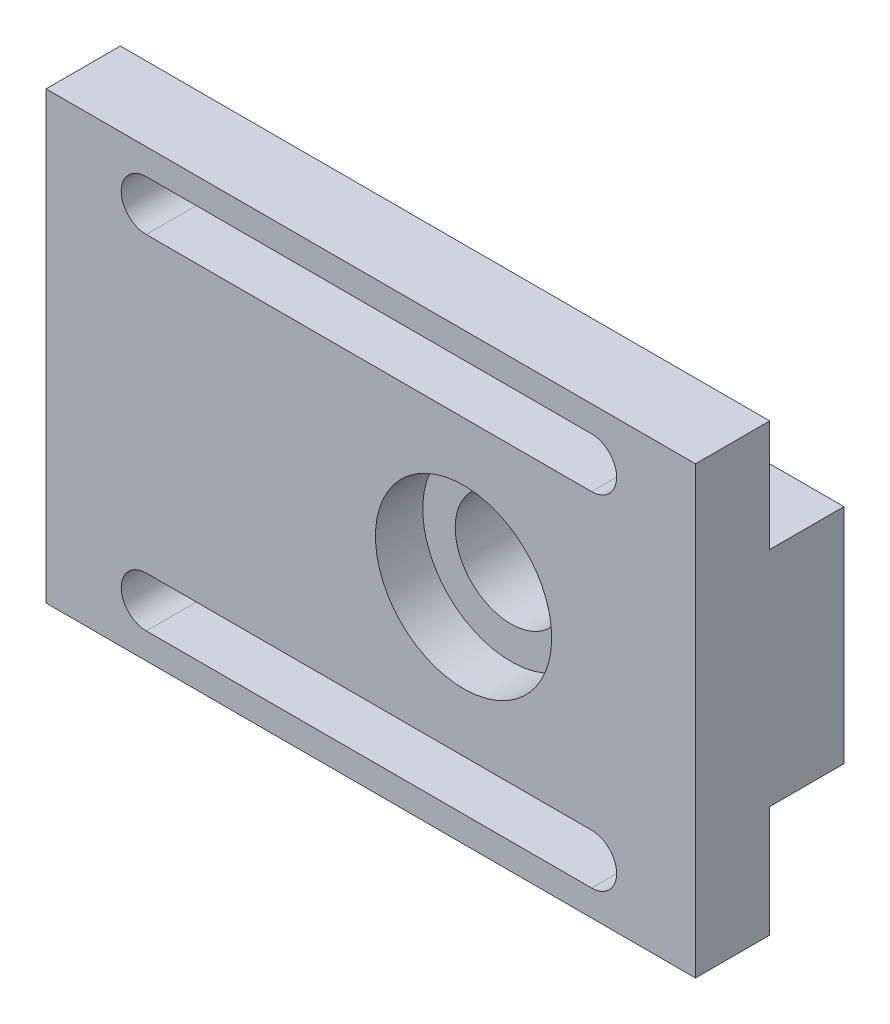
ISO-10303-21;
HEADER;
FILE_DESCRIPTION(('STEP AP214'),'2;1');
FILE_NAME('part.step','',(''),(''),'','','');
FILE_SCHEMA(('AUTOMOTIVE_DESIGN { 1 0 10303 214 1 1 1 1 }'));
ENDSEC;
DATA;
#1=APPLICATION_CONTEXT('core data for automotive mechanical design processes');
#2=APPLICATION_PROTOCOL_DEFINITION('international standard','automotive_design',2000,#1);
#3=PRODUCT_CONTEXT('',#1,'mechanical');
#4=PRODUCT('Part','Part','',(#3));
#5=PRODUCT_RELATED_PRODUCT_CATEGORY('part','',(#4));
#6=PRODUCT_DEFINITION_FORMATION('','',#4);
#7=PRODUCT_DEFINITION_CONTEXT('part definition',#1,'design');
#8=PRODUCT_DEFINITION('design','',#6,#7);
#9=PRODUCT_DEFINITION_SHAPE('','',#8);
#10=(LENGTH_UNIT() NAMED_UNIT(*) SI_UNIT(.MILLI.,.METRE.));
#11=(NAMED_UNIT(*) PLANE_ANGLE_UNIT() SI_UNIT($,.RADIAN.));
#12=(NAMED_UNIT(*) SI_UNIT($,.STERADIAN.) SOLID_ANGLE_UNIT());
#13=UNCERTAINTY_MEASURE_WITH_UNIT(LENGTH_MEASURE(1.E-05),#10,'distance_accuracy_value','');
#14=(GEOMETRIC_REPRESENTATION_CONTEXT(3) GLOBAL_UNCERTAINTY_ASSIGNED_CONTEXT((#13)) GLOBAL_UNIT_ASSIGNED_CONTEXT((#10,
#11,#12)) REPRESENTATION_CONTEXT('',''));
#15=CARTESIAN_POINT('',(0.,0.,0.));
#16=DIRECTION('',(0.,0.,1.));
#17=DIRECTION('',(1.,0.,0.));
#18=AXIS2_PLACEMENT_3D('',#15,#16,#17);
#19=CARTESIAN_POINT('',(45.,24.,8.));
#20=DIRECTION('',(0.,0.,-1.));
#21=DIRECTION('',(-1.,0.,0.));
#22=AXIS2_PLACEMENT_3D('',#19,#20,#21);
#23=CYLINDRICAL_SURFACE('',#22,6.00000000000001);
#24=CARTESIAN_POINT('',(45.,24.,-3.));
#25=DIRECTION('',(0.,0.,-1.));
#26=DIRECTION('',(-1.,0.,0.));
#27=AXIS2_PLACEMENT_3D('',#24,#25,#26);
#28=CIRCLE('',#27,6.00000000000001);
#29=CARTESIAN_POINT('',(39.,24.,-3.));
#30=VERTEX_POINT('',#29);
#31=EDGE_CURVE('E236',#30,#30,#28,.F.);
#32=ORIENTED_EDGE('',*,*,#31,.F.);
#33=EDGE_LOOP('',(#32));
#34=FACE_BOUND('',#33,.T.);
#35=CARTESIAN_POINT('',(45.,24.,2.9));
#36=DIRECTION('',(0.,0.,1.));
#37=DIRECTION('',(1.,0.,0.));
#38=AXIS2_PLACEMENT_3D('',#35,#36,#37);
#39=CIRCLE('',#38,6.00000000000001);
#40=CARTESIAN_POINT('',(51.,24.,2.9));
#41=VERTEX_POINT('',#40);
#42=EDGE_CURVE('E230',#41,#41,#39,.F.);
#43=ORIENTED_EDGE('',*,*,#42,.F.);
#44=EDGE_LOOP('',(#43));
#45=FACE_BOUND('',#44,.T.);
#46=ADVANCED_FACE('F39',(#34,#45),#23,.F.);
#47=CARTESIAN_POINT('',(0.,48.,0.));
#48=DIRECTION('',(0.,0.,-1.));
#49=DIRECTION('',(-1.,0.,0.));
#50=AXIS2_PLACEMENT_3D('',#47,#48,#49);
#51=PLANE('',#50);
#52=CARTESIAN_POINT('',(10.8004560122874,42.5,0.));
#53=DIRECTION('',(0.,0.,-1.));
#54=DIRECTION('',(-1.,0.,0.));
#55=AXIS2_PLACEMENT_3D('',#52,#53,#54);
#56=CIRCLE('',#55,2.7);
#57=CARTESIAN_POINT('',(10.8004560122874,39.8,0.));
#58=VERTEX_POINT('',#57);
#59=CARTESIAN_POINT('',(10.8004560122874,45.2,0.));
#60=VERTEX_POINT('',#59);
#61=EDGE_CURVE('E212',#58,#60,#56,.T.);
#62=ORIENTED_EDGE('',*,*,#61,.F.);
#63=DIRECTION('',(-1.,0.,0.));
#64=VECTOR('',#63,1.);
#65=CARTESIAN_POINT('',(0.,39.8,0.));
#66=LINE('',#65,#64);
#67=CARTESIAN_POINT('',(58.8004560122874,39.8,0.));
#68=VERTEX_POINT('',#67);
#69=EDGE_CURVE('E199',#68,#58,#66,.T.);
#70=ORIENTED_EDGE('',*,*,#69,.F.);
#71=CARTESIAN_POINT('',(58.8004560122874,42.5,0.));
#72=DIRECTION('',(0.,0.,-1.));
#73=DIRECTION('',(-1.,0.,0.));
#74=AXIS2_PLACEMENT_3D('',#71,#72,#73);
#75=CIRCLE('',#74,2.7);
#76=CARTESIAN_POINT('',(58.8004560122874,45.2,0.));
#77=VERTEX_POINT('',#76);
#78=EDGE_CURVE('E207',#77,#68,#75,.T.);
#79=ORIENTED_EDGE('',*,*,#78,.F.);
#80=DIRECTION('',(1.,0.,0.));
#81=VECTOR('',#80,1.);
#82=CARTESIAN_POINT('',(0.,45.2,0.));
#83=LINE('',#82,#81);
#84=EDGE_CURVE('E210',#60,#77,#83,.T.);
#85=ORIENTED_EDGE('',*,*,#84,.F.);
#86=EDGE_LOOP('',(#62,#70,#79,#85));
#87=FACE_BOUND('',#86,.T.);
#88=DIRECTION('',(1.,0.,0.));
#89=VECTOR('',#88,1.);
#90=CARTESIAN_POINT('',(70.,36.,0.));
#91=LINE('',#90,#89);
#92=CARTESIAN_POINT('',(0.,36.,0.));
#93=VERTEX_POINT('',#92);
#94=CARTESIAN_POINT('',(70.,36.,0.));
#95=VERTEX_POINT('',#94);
#96=EDGE_CURVE('E244',#93,#95,#91,.T.);
#97=ORIENTED_EDGE('',*,*,#96,.F.);
#98=DIRECTION('',(0.,-1.,0.));
#99=VECTOR('',#98,1.);
#100=CARTESIAN_POINT('',(0.,0.,0.));
#101=LINE('',#100,#99);
#102=CARTESIAN_POINT('',(0.,48.,0.));
#103=VERTEX_POINT('',#102);
#104=EDGE_CURVE('E368',#103,#93,#101,.T.);
#105=ORIENTED_EDGE('',*,*,#104,.F.);
#106=DIRECTION('',(-1.,0.,0.));
#107=VECTOR('',#106,1.);
#108=CARTESIAN_POINT('',(0.,48.,0.));
#109=LINE('',#108,#107);
#110=CARTESIAN_POINT('',(70.,48.,0.));
#111=VERTEX_POINT('',#110);
#112=EDGE_CURVE('E377',#111,#103,#109,.T.);
#113=ORIENTED_EDGE('',*,*,#112,.F.);
#114=DIRECTION('',(0.,1.,0.));
#115=VECTOR('',#114,1.);
#116=CARTESIAN_POINT('',(70.,0.,0.));
#117=LINE('',#116,#115);
#118=EDGE_CURVE('E260',#95,#111,#117,.T.);
#119=ORIENTED_EDGE('',*,*,#118,.F.);
#120=EDGE_LOOP('',(#97,#105,#113,#119));
#121=FACE_BOUND('',#120,.T.);
#122=ADVANCED_FACE('F315',(#87,#121),#51,.T.);
#123=CARTESIAN_POINT('',(0.,0.,8.));
#124=DIRECTION('',(1.,0.,0.));
#125=DIRECTION('',(0.,0.,-1.));
#126=AXIS2_PLACEMENT_3D('',#123,#124,#125);
#127=PLANE('',#126);
#128=ORIENTED_EDGE('',*,*,#104,.T.);
#129=DIRECTION('',(0.,0.,1.));
#130=VECTOR('',#129,1.);
#131=CARTESIAN_POINT('',(0.,36.,-8.));
#132=LINE('',#131,#130);
#133=CARTESIAN_POINT('',(0.,36.,-8.));
#134=VERTEX_POINT('',#133);
#135=EDGE_CURVE('E267',#134,#93,#132,.T.);
#136=ORIENTED_EDGE('',*,*,#135,.F.);
#137=DIRECTION('',(0.,1.,0.));
#138=VECTOR('',#137,1.);
#139=CARTESIAN_POINT('',(0.,12.,-8.));
#140=LINE('',#139,#138);
#141=CARTESIAN_POINT('',(0.,12.,-8.));
#142=VERTEX_POINT('',#141);
#143=EDGE_CURVE('E246',#142,#134,#140,.T.);
#144=ORIENTED_EDGE('',*,*,#143,.F.);
#145=DIRECTION('',(0.,0.,1.));
#146=VECTOR('',#145,1.);
#147=CARTESIAN_POINT('',(0.,12.,-8.));
#148=LINE('',#147,#146);
#149=CARTESIAN_POINT('',(0.,12.,0.));
#150=VERTEX_POINT('',#149);
#151=EDGE_CURVE('E263',#142,#150,#148,.T.);
#152=ORIENTED_EDGE('',*,*,#151,.T.);
#153=CARTESIAN_POINT('',(0.,0.,0.));
#154=VERTEX_POINT('',#153);
#155=EDGE_CURVE('E272',#150,#154,#101,.T.);
#156=ORIENTED_EDGE('',*,*,#155,.T.);
#157=DIRECTION('',(0.,0.,-1.));
#158=VECTOR('',#157,1.);
#159=CARTESIAN_POINT('',(0.,0.,8.));
#160=LINE('',#159,#158);
#161=CARTESIAN_POINT('',(0.,0.,8.));
#162=VERTEX_POINT('',#161);
#163=EDGE_CURVE('E291',#162,#154,#160,.T.);
#164=ORIENTED_EDGE('',*,*,#163,.F.);
#165=DIRECTION('',(0.,-1.,0.));
#166=VECTOR('',#165,1.);
#167=CARTESIAN_POINT('',(0.,0.,8.));
#168=LINE('',#167,#166);
#169=CARTESIAN_POINT('',(0.,48.,8.));
#170=VERTEX_POINT('',#169);
#171=EDGE_CURVE('E378',#170,#162,#168,.T.);
#172=ORIENTED_EDGE('',*,*,#171,.F.);
#173=DIRECTION('',(0.,0.,-1.));
#174=VECTOR('',#173,1.);
#175=CARTESIAN_POINT('',(0.,48.,8.));
#176=LINE('',#175,#174);
#177=EDGE_CURVE('E386',#170,#103,#176,.T.);
#178=ORIENTED_EDGE('',*,*,#177,.T.);
#179=EDGE_LOOP('',(#128,#136,#144,#152,#156,#164,#172,#178));
#180=FACE_BOUND('',#179,.T.);
#181=ADVANCED_FACE('F41',(#180),#127,.F.);
#182=CARTESIAN_POINT('',(0.,0.,8.));
#183=DIRECTION('',(0.,1.,0.));
#184=DIRECTION('',(0.,0.,1.));
#185=AXIS2_PLACEMENT_3D('',#182,#183,#184);
#186=PLANE('',#185);
#187=DIRECTION('',(1.,0.,0.));
#188=VECTOR('',#187,1.);
#189=CARTESIAN_POINT('',(0.,0.,0.));
#190=LINE('',#189,#188);
#191=CARTESIAN_POINT('',(70.,0.,0.));
#192=VERTEX_POINT('',#191);
#193=EDGE_CURVE('E362',#154,#192,#190,.T.);
#194=ORIENTED_EDGE('',*,*,#193,.T.);
#195=DIRECTION('',(0.,0.,-1.));
#196=VECTOR('',#195,1.);
#197=CARTESIAN_POINT('',(70.,0.,8.));
#198=LINE('',#197,#196);
#199=CARTESIAN_POINT('',(70.,0.,8.));
#200=VERTEX_POINT('',#199);
#201=EDGE_CURVE('E364',#200,#192,#198,.T.);
#202=ORIENTED_EDGE('',*,*,#201,.F.);
#203=DIRECTION('',(1.,0.,0.));
#204=VECTOR('',#203,1.);
#205=CARTESIAN_POINT('',(0.,0.,8.));
#206=LINE('',#205,#204);
#207=EDGE_CURVE('E398',#162,#200,#206,.T.);
#208=ORIENTED_EDGE('',*,*,#207,.F.);
#209=ORIENTED_EDGE('',*,*,#163,.T.);
#210=EDGE_LOOP('',(#194,#202,#208,#209));
#211=FACE_BOUND('',#210,.T.);
#212=ADVANCED_FACE('F351',(#211),#186,.F.);
#213=CARTESIAN_POINT('',(70.,0.,8.));
#214=DIRECTION('',(-1.,0.,0.));
#215=DIRECTION('',(0.,0.,1.));
#216=AXIS2_PLACEMENT_3D('',#213,#214,#215);
#217=PLANE('',#216);
#218=CARTESIAN_POINT('',(70.,12.,0.));
#219=VERTEX_POINT('',#218);
#220=EDGE_CURVE('E372',#192,#219,#117,.T.);
#221=ORIENTED_EDGE('',*,*,#220,.T.);
#222=DIRECTION('',(0.,0.,1.));
#223=VECTOR('',#222,1.);
#224=CARTESIAN_POINT('',(70.,12.,-8.));
#225=LINE('',#224,#223);
#226=CARTESIAN_POINT('',(70.,12.,-8.));
#227=VERTEX_POINT('',#226);
#228=EDGE_CURVE('E266',#227,#219,#225,.T.);
#229=ORIENTED_EDGE('',*,*,#228,.F.);
#230=DIRECTION('',(0.,-1.,0.));
#231=VECTOR('',#230,1.);
#232=CARTESIAN_POINT('',(70.,12.,-8.));
#233=LINE('',#232,#231);
#234=CARTESIAN_POINT('',(70.,36.,-8.));
#235=VERTEX_POINT('',#234);
#236=EDGE_CURVE('E240',#235,#227,#233,.T.);
#237=ORIENTED_EDGE('',*,*,#236,.F.);
#238=DIRECTION('',(0.,0.,1.));
#239=VECTOR('',#238,1.);
#240=CARTESIAN_POINT('',(70.,36.,-8.));
#241=LINE('',#240,#239);
#242=EDGE_CURVE('E250',#235,#95,#241,.T.);
#243=ORIENTED_EDGE('',*,*,#242,.T.);
#244=ORIENTED_EDGE('',*,*,#118,.T.);
#245=DIRECTION('',(0.,0.,-1.));
#246=VECTOR('',#245,1.);
#247=CARTESIAN_POINT('',(70.,48.,8.));
#248=LINE('',#247,#246);
#249=CARTESIAN_POINT('',(70.,48.,8.));
#250=VERTEX_POINT('',#249);
#251=EDGE_CURVE('E375',#250,#111,#248,.T.);
#252=ORIENTED_EDGE('',*,*,#251,.F.);
#253=DIRECTION('',(0.,1.,0.));
#254=VECTOR('',#253,1.);
#255=CARTESIAN_POINT('',(70.,0.,8.));
#256=LINE('',#255,#254);
#257=EDGE_CURVE('E374',#200,#250,#256,.T.);
#258=ORIENTED_EDGE('',*,*,#257,.F.);
#259=ORIENTED_EDGE('',*,*,#201,.T.);
#260=EDGE_LOOP('',(#221,#229,#237,#243,#244,#252,#258,#259));
#261=FACE_BOUND('',#260,.T.);
#262=ADVANCED_FACE('F348',(#261),#217,.F.);
#263=CARTESIAN_POINT('',(0.,48.,8.));
#264=DIRECTION('',(0.,-1.,0.));
#265=DIRECTION('',(0.,0.,-1.));
#266=AXIS2_PLACEMENT_3D('',#263,#264,#265);
#267=PLANE('',#266);
#268=ORIENTED_EDGE('',*,*,#112,.T.);
#269=ORIENTED_EDGE('',*,*,#177,.F.);
#270=DIRECTION('',(-1.,0.,0.));
#271=VECTOR('',#270,1.);
#272=CARTESIAN_POINT('',(0.,48.,8.));
#273=LINE('',#272,#271);
#274=EDGE_CURVE('E389',#250,#170,#273,.T.);
#275=ORIENTED_EDGE('',*,*,#274,.F.);
#276=ORIENTED_EDGE('',*,*,#251,.T.);
#277=EDGE_LOOP('',(#268,#269,#275,#276));
#278=FACE_BOUND('',#277,.T.);
#279=ADVANCED_FACE('F343',(#278),#267,.F.);
#280=CARTESIAN_POINT('',(0.,48.,8.));
#281=DIRECTION('',(0.,0.,-1.));
#282=DIRECTION('',(-1.,0.,0.));
#283=AXIS2_PLACEMENT_3D('',#280,#281,#282);
#284=PLANE('',#283);
#285=DIRECTION('',(1.,0.,0.));
#286=VECTOR('',#285,1.);
#287=CARTESIAN_POINT('',(10.8004560122874,2.8,8.));
#288=LINE('',#287,#286);
#289=CARTESIAN_POINT('',(10.8004560122874,2.8,8.));
#290=VERTEX_POINT('',#289);
#291=CARTESIAN_POINT('',(58.8004560122874,2.8,8.));
#292=VERTEX_POINT('',#291);
#293=EDGE_CURVE('E169',#290,#292,#288,.T.);
#294=ORIENTED_EDGE('',*,*,#293,.F.);
#295=CARTESIAN_POINT('',(10.8004560122874,5.5,8.));
#296=DIRECTION('',(0.,0.,1.));
#297=DIRECTION('',(-1.,0.,0.));
#298=AXIS2_PLACEMENT_3D('',#295,#296,#297);
#299=CIRCLE('',#298,2.7);
#300=CARTESIAN_POINT('',(10.8004560122874,8.2,8.));
#301=VERTEX_POINT('',#300);
#302=EDGE_CURVE('E54',#301,#290,#299,.T.);
#303=ORIENTED_EDGE('',*,*,#302,.F.);
#304=DIRECTION('',(-1.,0.,0.));
#305=VECTOR('',#304,1.);
#306=CARTESIAN_POINT('',(10.8004560122874,8.2,8.));
#307=LINE('',#306,#305);
#308=CARTESIAN_POINT('',(58.8004560122874,8.2,8.));
#309=VERTEX_POINT('',#308);
#310=EDGE_CURVE('E176',#309,#301,#307,.T.);
#311=ORIENTED_EDGE('',*,*,#310,.F.);
#312=CARTESIAN_POINT('',(58.8004560122874,5.5,8.));
#313=DIRECTION('',(0.,0.,1.));
#314=DIRECTION('',(-1.,0.,0.));
#315=AXIS2_PLACEMENT_3D('',#312,#313,#314);
#316=CIRCLE('',#315,2.7);
#317=EDGE_CURVE('E160',#292,#309,#316,.T.);
#318=ORIENTED_EDGE('',*,*,#317,.F.);
#319=EDGE_LOOP('',(#294,#303,#311,#318));
#320=FACE_BOUND('',#319,.T.);
#321=DIRECTION('',(1.,0.,0.));
#322=VECTOR('',#321,1.);
#323=CARTESIAN_POINT('',(10.8004560122874,39.8,8.));
#324=LINE('',#323,#322);
#325=CARTESIAN_POINT('',(10.8004560122874,39.8,8.));
#326=VERTEX_POINT('',#325);
#327=CARTESIAN_POINT('',(58.8004560122874,39.8,8.));
#328=VERTEX_POINT('',#327);
#329=EDGE_CURVE('E187',#326,#328,#324,.T.);
#330=ORIENTED_EDGE('',*,*,#329,.F.);
#331=CARTESIAN_POINT('',(10.8004560122874,42.5,8.));
#332=DIRECTION('',(0.,0.,1.));
#333=DIRECTION('',(1.,0.,0.));
#334=AXIS2_PLACEMENT_3D('',#331,#332,#333);
#335=CIRCLE('',#334,2.7);
#336=CARTESIAN_POINT('',(10.8004560122874,45.2,8.));
#337=VERTEX_POINT('',#336);
#338=EDGE_CURVE('E183',#337,#326,#335,.T.);
#339=ORIENTED_EDGE('',*,*,#338,.F.);
#340=DIRECTION('',(-1.,0.,0.));
#341=VECTOR('',#340,1.);
#342=CARTESIAN_POINT('',(10.8004560122874,45.2,8.));
#343=LINE('',#342,#341);
#344=CARTESIAN_POINT('',(58.8004560122874,45.2,8.));
#345=VERTEX_POINT('',#344);
#346=EDGE_CURVE('E193',#345,#337,#343,.T.);
#347=ORIENTED_EDGE('',*,*,#346,.F.);
#348=CARTESIAN_POINT('',(58.8004560122874,42.5,8.));
#349=DIRECTION('',(0.,0.,1.));
#350=DIRECTION('',(1.,0.,0.));
#351=AXIS2_PLACEMENT_3D('',#348,#349,#350);
#352=CIRCLE('',#351,2.7);
#353=EDGE_CURVE('E190',#328,#345,#352,.T.);
#354=ORIENTED_EDGE('',*,*,#353,.F.);
#355=EDGE_LOOP('',(#330,#339,#347,#354));
#356=FACE_BOUND('',#355,.T.);
#357=CARTESIAN_POINT('',(45.,24.,8.));
#358=DIRECTION('',(0.,0.,1.));
#359=DIRECTION('',(1.,0.,0.));
#360=AXIS2_PLACEMENT_3D('',#357,#358,#359);
#361=CIRCLE('',#360,9.5);
#362=CARTESIAN_POINT('',(54.5,24.,8.));
#363=VERTEX_POINT('',#362);
#364=EDGE_CURVE('E226',#363,#363,#361,.T.);
#365=ORIENTED_EDGE('',*,*,#364,.F.);
#366=EDGE_LOOP('',(#365));
#367=FACE_BOUND('',#366,.T.);
#368=ORIENTED_EDGE('',*,*,#171,.T.);
#369=ORIENTED_EDGE('',*,*,#207,.T.);
#370=ORIENTED_EDGE('',*,*,#257,.T.);
#371=ORIENTED_EDGE('',*,*,#274,.T.);
#372=EDGE_LOOP('',(#368,#369,#370,#371));
#373=FACE_BOUND('',#372,.T.);
#374=ADVANCED_FACE('F173',(#320,#356,#367,#373),#284,.F.);
#375=CARTESIAN_POINT('',(10.8004560122874,5.5,0.));
#376=DIRECTION('',(0.,0.,-1.));
#377=DIRECTION('',(-1.,0.,0.));
#378=AXIS2_PLACEMENT_3D('',#375,#376,#377);
#379=CIRCLE('',#378,2.7);
#380=CARTESIAN_POINT('',(10.8004560122874,2.8,0.));
#381=VERTEX_POINT('',#380);
#382=CARTESIAN_POINT('',(10.8004560122874,8.2,0.));
#383=VERTEX_POINT('',#382);
#384=EDGE_CURVE('E11',#381,#383,#379,.T.);
#385=ORIENTED_EDGE('',*,*,#384,.F.);
#386=DIRECTION('',(-1.,0.,0.));
#387=VECTOR('',#386,1.);
#388=CARTESIAN_POINT('',(0.,2.8,0.));
#389=LINE('',#388,#387);
#390=CARTESIAN_POINT('',(58.8004560122874,2.8,0.));
#391=VERTEX_POINT('',#390);
#392=EDGE_CURVE('E289',#391,#381,#389,.T.);
#393=ORIENTED_EDGE('',*,*,#392,.F.);
#394=CARTESIAN_POINT('',(58.8004560122874,5.5,0.));
#395=DIRECTION('',(0.,0.,-1.));
#396=DIRECTION('',(-1.,0.,0.));
#397=AXIS2_PLACEMENT_3D('',#394,#395,#396);
#398=CIRCLE('',#397,2.7);
#399=CARTESIAN_POINT('',(58.8004560122874,8.2,0.));
#400=VERTEX_POINT('',#399);
#401=EDGE_CURVE('E163',#400,#391,#398,.T.);
#402=ORIENTED_EDGE('',*,*,#401,.F.);
#403=DIRECTION('',(1.,0.,0.));
#404=VECTOR('',#403,1.);
#405=CARTESIAN_POINT('',(0.,8.2,0.));
#406=LINE('',#405,#404);
#407=EDGE_CURVE('E47',#383,#400,#406,.T.);
#408=ORIENTED_EDGE('',*,*,#407,.F.);
#409=EDGE_LOOP('',(#385,#393,#402,#408));
#410=FACE_BOUND('',#409,.T.);
#411=DIRECTION('',(-1.,0.,0.));
#412=VECTOR('',#411,1.);
#413=CARTESIAN_POINT('',(70.,12.,0.));
#414=LINE('',#413,#412);
#415=EDGE_CURVE('E256',#219,#150,#414,.T.);
#416=ORIENTED_EDGE('',*,*,#415,.F.);
#417=ORIENTED_EDGE('',*,*,#220,.F.);
#418=ORIENTED_EDGE('',*,*,#193,.F.);
#419=ORIENTED_EDGE('',*,*,#155,.F.);
#420=EDGE_LOOP('',(#416,#417,#418,#419));
#421=FACE_BOUND('',#420,.T.);
#422=ADVANCED_FACE('F298',(#410,#421),#51,.T.);
#423=CARTESIAN_POINT('',(70.,12.,-8.));
#424=DIRECTION('',(0.,1.,0.));
#425=DIRECTION('',(0.,0.,1.));
#426=AXIS2_PLACEMENT_3D('',#423,#424,#425);
#427=PLANE('',#426);
#428=ORIENTED_EDGE('',*,*,#415,.T.);
#429=ORIENTED_EDGE('',*,*,#151,.F.);
#430=DIRECTION('',(-1.,0.,0.));
#431=VECTOR('',#430,1.);
#432=CARTESIAN_POINT('',(70.,12.,-8.));
#433=LINE('',#432,#431);
#434=EDGE_CURVE('E243',#227,#142,#433,.T.);
#435=ORIENTED_EDGE('',*,*,#434,.F.);
#436=ORIENTED_EDGE('',*,*,#228,.T.);
#437=EDGE_LOOP('',(#428,#429,#435,#436));
#438=FACE_BOUND('',#437,.T.);
#439=ADVANCED_FACE('F337',(#438),#427,.F.);
#440=CARTESIAN_POINT('',(70.,36.,-8.));
#441=DIRECTION('',(0.,-1.,0.));
#442=DIRECTION('',(1.,0.,0.));
#443=AXIS2_PLACEMENT_3D('',#440,#441,#442);
#444=PLANE('',#443);
#445=ORIENTED_EDGE('',*,*,#96,.T.);
#446=ORIENTED_EDGE('',*,*,#242,.F.);
#447=DIRECTION('',(1.,0.,0.));
#448=VECTOR('',#447,1.);
#449=CARTESIAN_POINT('',(70.,36.,-8.));
#450=LINE('',#449,#448);
#451=EDGE_CURVE('E248',#134,#235,#450,.T.);
#452=ORIENTED_EDGE('',*,*,#451,.F.);
#453=ORIENTED_EDGE('',*,*,#135,.T.);
#454=EDGE_LOOP('',(#445,#446,#452,#453));
#455=FACE_BOUND('',#454,.T.);
#456=ADVANCED_FACE('F333',(#455),#444,.F.);
#457=CARTESIAN_POINT('',(70.,36.,-8.));
#458=DIRECTION('',(0.,0.,1.));
#459=DIRECTION('',(1.,0.,0.));
#460=AXIS2_PLACEMENT_3D('',#457,#458,#459);
#461=PLANE('',#460);
#462=CARTESIAN_POINT('',(57.5,24.,-8.));
#463=DIRECTION('',(0.,0.,-1.));
#464=DIRECTION('',(-1.,0.,0.));
#465=AXIS2_PLACEMENT_3D('',#462,#463,#464);
#466=CIRCLE('',#465,1.65);
#467=CARTESIAN_POINT('',(55.85,24.,-8.));
#468=VERTEX_POINT('',#467);
#469=EDGE_CURVE('E214',#468,#468,#466,.T.);
#470=ORIENTED_EDGE('',*,*,#469,.F.);
#471=EDGE_LOOP('',(#470));
#472=FACE_BOUND('',#471,.T.);
#473=CARTESIAN_POINT('',(32.5,24.,-8.));
#474=DIRECTION('',(0.,0.,-1.));
#475=DIRECTION('',(-1.,0.,0.));
#476=AXIS2_PLACEMENT_3D('',#473,#474,#475);
#477=CIRCLE('',#476,1.65);
#478=CARTESIAN_POINT('',(30.85,24.,-8.));
#479=VERTEX_POINT('',#478);
#480=EDGE_CURVE('E220',#479,#479,#477,.T.);
#481=ORIENTED_EDGE('',*,*,#480,.F.);
#482=EDGE_LOOP('',(#481));
#483=FACE_BOUND('',#482,.T.);
#484=CARTESIAN_POINT('',(45.,24.,-8.));
#485=DIRECTION('',(0.,0.,-1.));
#486=DIRECTION('',(-1.,0.,0.));
#487=AXIS2_PLACEMENT_3D('',#484,#485,#486);
#488=CIRCLE('',#487,9.5);
#489=CARTESIAN_POINT('',(35.5,24.,-8.));
#490=VERTEX_POINT('',#489);
#491=EDGE_CURVE('E237',#490,#490,#488,.T.);
#492=ORIENTED_EDGE('',*,*,#491,.F.);
#493=EDGE_LOOP('',(#492));
#494=FACE_BOUND('',#493,.T.);
#495=ORIENTED_EDGE('',*,*,#236,.T.);
#496=ORIENTED_EDGE('',*,*,#434,.T.);
#497=ORIENTED_EDGE('',*,*,#143,.T.);
#498=ORIENTED_EDGE('',*,*,#451,.T.);
#499=EDGE_LOOP('',(#495,#496,#497,#498));
#500=FACE_BOUND('',#499,.T.);
#501=ADVANCED_FACE('F329',(#472,#483,#494,#500),#461,.F.);
#502=CARTESIAN_POINT('',(45.,24.,-3.));
#503=DIRECTION('',(0.,0.,-1.));
#504=DIRECTION('',(-1.,0.,0.));
#505=AXIS2_PLACEMENT_3D('',#502,#503,#504);
#506=PLANE('',#505);
#507=CARTESIAN_POINT('',(45.,24.,-3.));
#508=DIRECTION('',(0.,0.,-1.));
#509=DIRECTION('',(-1.,0.,0.));
#510=AXIS2_PLACEMENT_3D('',#507,#508,#509);
#511=CIRCLE('',#510,9.5);
#512=CARTESIAN_POINT('',(35.5,24.,-3.));
#513=VERTEX_POINT('',#512);
#514=EDGE_CURVE('E233',#513,#513,#511,.T.);
#515=ORIENTED_EDGE('',*,*,#514,.T.);
#516=EDGE_LOOP('',(#515));
#517=FACE_BOUND('',#516,.T.);
#518=ORIENTED_EDGE('',*,*,#31,.T.);
#519=EDGE_LOOP('',(#518));
#520=FACE_BOUND('',#519,.T.);
#521=ADVANCED_FACE('F332',(#517,#520),#506,.T.);
#522=CARTESIAN_POINT('',(45.,24.,-3.));
#523=DIRECTION('',(0.,0.,-1.));
#524=DIRECTION('',(-1.,0.,0.));
#525=AXIS2_PLACEMENT_3D('',#522,#523,#524);
#526=CYLINDRICAL_SURFACE('',#525,9.5);
#527=ORIENTED_EDGE('',*,*,#514,.F.);
#528=EDGE_LOOP('',(#527));
#529=FACE_BOUND('',#528,.T.);
#530=ORIENTED_EDGE('',*,*,#491,.T.);
#531=EDGE_LOOP('',(#530));
#532=FACE_BOUND('',#531,.T.);
#533=ADVANCED_FACE('F327',(#529,#532),#526,.F.);
#534=CARTESIAN_POINT('',(45.,24.,2.9));
#535=DIRECTION('',(0.,0.,1.));
#536=DIRECTION('',(1.,0.,0.));
#537=AXIS2_PLACEMENT_3D('',#534,#535,#536);
#538=PLANE('',#537);
#539=CARTESIAN_POINT('',(45.,24.,2.9));
#540=DIRECTION('',(0.,0.,1.));
#541=DIRECTION('',(1.,0.,0.));
#542=AXIS2_PLACEMENT_3D('',#539,#540,#541);
#543=CIRCLE('',#542,9.5);
#544=CARTESIAN_POINT('',(54.5,24.,2.9));
#545=VERTEX_POINT('',#544);
#546=EDGE_CURVE('E227',#545,#545,#543,.T.);
#547=ORIENTED_EDGE('',*,*,#546,.T.);
#548=EDGE_LOOP('',(#547));
#549=FACE_BOUND('',#548,.T.);
#550=ORIENTED_EDGE('',*,*,#42,.T.);
#551=EDGE_LOOP('',(#550));
#552=FACE_BOUND('',#551,.T.);
#553=ADVANCED_FACE('F521',(#549,#552),#538,.T.);
#554=CARTESIAN_POINT('',(45.,24.,2.9));
#555=DIRECTION('',(0.,0.,1.));
#556=DIRECTION('',(1.,0.,0.));
#557=AXIS2_PLACEMENT_3D('',#554,#555,#556);
#558=CYLINDRICAL_SURFACE('',#557,9.5);
#559=ORIENTED_EDGE('',*,*,#546,.F.);
#560=EDGE_LOOP('',(#559));
#561=FACE_BOUND('',#560,.T.);
#562=ORIENTED_EDGE('',*,*,#364,.T.);
#563=EDGE_LOOP('',(#562));
#564=FACE_BOUND('',#563,.T.);
#565=ADVANCED_FACE('F519',(#561,#564),#558,.F.);
#566=CARTESIAN_POINT('',(32.5,24.,2.1));
#567=DIRECTION('',(0.,0.,-1.));
#568=DIRECTION('',(-1.,0.,0.));
#569=AXIS2_PLACEMENT_3D('',#566,#567,#568);
#570=CONICAL_SURFACE('',#569,1.65,1.02974425867665);
#571=CARTESIAN_POINT('',(32.5,24.,3.09142002139548));
#572=VERTEX_POINT('',#571);
#573=VERTEX_LOOP('',#572);
#574=FACE_BOUND('',#573,.T.);
#575=CARTESIAN_POINT('',(32.5,24.,2.1));
#576=DIRECTION('',(0.,0.,-1.));
#577=DIRECTION('',(-1.,0.,0.));
#578=AXIS2_PLACEMENT_3D('',#575,#576,#577);
#579=CIRCLE('',#578,1.65);
#580=CARTESIAN_POINT('',(30.85,24.,2.1));
#581=VERTEX_POINT('',#580);
#582=EDGE_CURVE('E223',#581,#581,#579,.T.);
#583=ORIENTED_EDGE('',*,*,#582,.T.);
#584=EDGE_LOOP('',(#583));
#585=FACE_BOUND('',#584,.T.);
#586=ADVANCED_FACE('F515',(#574,#585),#570,.F.);
#587=CARTESIAN_POINT('',(32.5,24.,-8.));
#588=DIRECTION('',(0.,0.,-1.));
#589=DIRECTION('',(-1.,0.,0.));
#590=AXIS2_PLACEMENT_3D('',#587,#588,#589);
#591=CYLINDRICAL_SURFACE('',#590,1.65);
#592=ORIENTED_EDGE('',*,*,#582,.F.);
#593=EDGE_LOOP('',(#592));
#594=FACE_BOUND('',#593,.T.);
#595=ORIENTED_EDGE('',*,*,#480,.T.);
#596=EDGE_LOOP('',(#595));
#597=FACE_BOUND('',#596,.T.);
#598=ADVANCED_FACE('F511',(#594,#597),#591,.F.);
#599=CARTESIAN_POINT('',(57.5,24.,2.1));
#600=DIRECTION('',(0.,0.,-1.));
#601=DIRECTION('',(-1.,0.,0.));
#602=AXIS2_PLACEMENT_3D('',#599,#600,#601);
#603=CONICAL_SURFACE('',#602,1.65,1.02974425867665);
#604=CARTESIAN_POINT('',(57.5,24.,3.09142002139548));
#605=VERTEX_POINT('',#604);
#606=VERTEX_LOOP('',#605);
#607=FACE_BOUND('',#606,.T.);
#608=CARTESIAN_POINT('',(57.5,24.,2.1));
#609=DIRECTION('',(0.,0.,-1.));
#610=DIRECTION('',(-1.,0.,0.));
#611=AXIS2_PLACEMENT_3D('',#608,#609,#610);
#612=CIRCLE('',#611,1.65);
#613=CARTESIAN_POINT('',(55.85,24.,2.1));
#614=VERTEX_POINT('',#613);
#615=EDGE_CURVE('E217',#614,#614,#612,.T.);
#616=ORIENTED_EDGE('',*,*,#615,.T.);
#617=EDGE_LOOP('',(#616));
#618=FACE_BOUND('',#617,.T.);
#619=ADVANCED_FACE('F507',(#607,#618),#603,.F.);
#620=CARTESIAN_POINT('',(57.5,24.,-8.));
#621=DIRECTION('',(0.,0.,-1.));
#622=DIRECTION('',(-1.,0.,0.));
#623=AXIS2_PLACEMENT_3D('',#620,#621,#622);
#624=CYLINDRICAL_SURFACE('',#623,1.65);
#625=ORIENTED_EDGE('',*,*,#615,.F.);
#626=EDGE_LOOP('',(#625));
#627=FACE_BOUND('',#626,.T.);
#628=ORIENTED_EDGE('',*,*,#469,.T.);
#629=EDGE_LOOP('',(#628));
#630=FACE_BOUND('',#629,.T.);
#631=ADVANCED_FACE('F429',(#627,#630),#624,.F.);
#632=CARTESIAN_POINT('',(10.8004560122874,42.5,-8.000025));
#633=DIRECTION('',(0.,0.,1.));
#634=DIRECTION('',(1.,0.,0.));
#635=AXIS2_PLACEMENT_3D('',#632,#633,#634);
#636=CYLINDRICAL_SURFACE('',#635,2.7);
#637=ORIENTED_EDGE('',*,*,#61,.T.);
#638=DIRECTION('',(0.,0.,1.));
#639=VECTOR('',#638,1.);
#640=CARTESIAN_POINT('',(10.8004560122874,45.2,-8.000025));
#641=LINE('',#640,#639);
#642=EDGE_CURVE('E197',#60,#337,#641,.T.);
#643=ORIENTED_EDGE('',*,*,#642,.T.);
#644=ORIENTED_EDGE('',*,*,#338,.T.);
#645=DIRECTION('',(0.,0.,1.));
#646=VECTOR('',#645,1.);
#647=CARTESIAN_POINT('',(10.8004560122874,39.8,-8.000025));
#648=LINE('',#647,#646);
#649=EDGE_CURVE('E196',#58,#326,#648,.T.);
#650=ORIENTED_EDGE('',*,*,#649,.F.);
#651=EDGE_LOOP('',(#637,#643,#644,#650));
#652=FACE_BOUND('',#651,.T.);
#653=ADVANCED_FACE('F446',(#652),#636,.F.);
#654=CARTESIAN_POINT('',(10.8004560122874,45.2,-8.000025));
#655=DIRECTION('',(0.,1.,0.));
#656=DIRECTION('',(0.,0.,1.));
#657=AXIS2_PLACEMENT_3D('',#654,#655,#656);
#658=PLANE('',#657);
#659=ORIENTED_EDGE('',*,*,#84,.T.);
#660=DIRECTION('',(0.,0.,1.));
#661=VECTOR('',#660,1.);
#662=CARTESIAN_POINT('',(58.8004560122874,45.2,-8.000025));
#663=LINE('',#662,#661);
#664=EDGE_CURVE('E200',#77,#345,#663,.T.);
#665=ORIENTED_EDGE('',*,*,#664,.T.);
#666=ORIENTED_EDGE('',*,*,#346,.T.);
#667=ORIENTED_EDGE('',*,*,#642,.F.);
#668=EDGE_LOOP('',(#659,#665,#666,#667));
#669=FACE_BOUND('',#668,.T.);
#670=ADVANCED_FACE('F451',(#669),#658,.F.);
#671=CARTESIAN_POINT('',(58.8004560122874,42.5,-8.000025));
#672=DIRECTION('',(0.,0.,1.));
#673=DIRECTION('',(1.,0.,0.));
#674=AXIS2_PLACEMENT_3D('',#671,#672,#673);
#675=CYLINDRICAL_SURFACE('',#674,2.7);
#676=ORIENTED_EDGE('',*,*,#78,.T.);
#677=DIRECTION('',(0.,0.,1.));
#678=VECTOR('',#677,1.);
#679=CARTESIAN_POINT('',(58.8004560122874,39.8,-8.000025));
#680=LINE('',#679,#678);
#681=EDGE_CURVE('E202',#68,#328,#680,.T.);
#682=ORIENTED_EDGE('',*,*,#681,.T.);
#683=ORIENTED_EDGE('',*,*,#353,.T.);
#684=ORIENTED_EDGE('',*,*,#664,.F.);
#685=EDGE_LOOP('',(#676,#682,#683,#684));
#686=FACE_BOUND('',#685,.T.);
#687=ADVANCED_FACE('F309',(#686),#675,.F.);
#688=CARTESIAN_POINT('',(10.8004560122874,39.8,-8.000025));
#689=DIRECTION('',(0.,-1.,0.));
#690=DIRECTION('',(0.,0.,-1.));
#691=AXIS2_PLACEMENT_3D('',#688,#689,#690);
#692=PLANE('',#691);
#693=ORIENTED_EDGE('',*,*,#69,.T.);
#694=ORIENTED_EDGE('',*,*,#649,.T.);
#695=ORIENTED_EDGE('',*,*,#329,.T.);
#696=ORIENTED_EDGE('',*,*,#681,.F.);
#697=EDGE_LOOP('',(#693,#694,#695,#696));
#698=FACE_BOUND('',#697,.T.);
#699=ADVANCED_FACE('F302',(#698),#692,.F.);
#700=CARTESIAN_POINT('',(10.8004560122874,5.5,-8.000025));
#701=DIRECTION('',(0.,0.,1.));
#702=DIRECTION('',(1.,0.,0.));
#703=AXIS2_PLACEMENT_3D('',#700,#701,#702);
#704=CYLINDRICAL_SURFACE('',#703,2.7);
#705=ORIENTED_EDGE('',*,*,#384,.T.);
#706=DIRECTION('',(0.,0.,1.));
#707=VECTOR('',#706,1.);
#708=CARTESIAN_POINT('',(10.8004560122874,8.2,-8.000025));
#709=LINE('',#708,#707);
#710=EDGE_CURVE('E181',#383,#301,#709,.T.);
#711=ORIENTED_EDGE('',*,*,#710,.T.);
#712=ORIENTED_EDGE('',*,*,#302,.T.);
#713=DIRECTION('',(0.,0.,1.));
#714=VECTOR('',#713,1.);
#715=CARTESIAN_POINT('',(10.8004560122874,2.8,-8.000025));
#716=LINE('',#715,#714);
#717=EDGE_CURVE('E166',#381,#290,#716,.T.);
#718=ORIENTED_EDGE('',*,*,#717,.F.);
#719=EDGE_LOOP('',(#705,#711,#712,#718));
#720=FACE_BOUND('',#719,.T.);
#721=ADVANCED_FACE('F300',(#720),#704,.F.);
#722=CARTESIAN_POINT('',(10.8004560122874,8.2,-8.000025));
#723=DIRECTION('',(0.,1.,0.));
#724=DIRECTION('',(0.,0.,1.));
#725=AXIS2_PLACEMENT_3D('',#722,#723,#724);
#726=PLANE('',#725);
#727=ORIENTED_EDGE('',*,*,#407,.T.);
#728=DIRECTION('',(0.,0.,1.));
#729=VECTOR('',#728,1.);
#730=CARTESIAN_POINT('',(58.8004560122874,8.2,-8.000025));
#731=LINE('',#730,#729);
#732=EDGE_CURVE('E165',#400,#309,#731,.T.);
#733=ORIENTED_EDGE('',*,*,#732,.T.);
#734=ORIENTED_EDGE('',*,*,#310,.T.);
#735=ORIENTED_EDGE('',*,*,#710,.F.);
#736=EDGE_LOOP('',(#727,#733,#734,#735));
#737=FACE_BOUND('',#736,.T.);
#738=ADVANCED_FACE('F295',(#737),#726,.F.);
#739=CARTESIAN_POINT('',(58.8004560122874,5.5,-8.000025));
#740=DIRECTION('',(0.,0.,1.));
#741=DIRECTION('',(1.,0.,0.));
#742=AXIS2_PLACEMENT_3D('',#739,#740,#741);
#743=CYLINDRICAL_SURFACE('',#742,2.7);
#744=ORIENTED_EDGE('',*,*,#401,.T.);
#745=DIRECTION('',(0.,0.,1.));
#746=VECTOR('',#745,1.);
#747=CARTESIAN_POINT('',(58.8004560122874,2.8,-8.000025));
#748=LINE('',#747,#746);
#749=EDGE_CURVE('E62',#391,#292,#748,.T.);
#750=ORIENTED_EDGE('',*,*,#749,.T.);
#751=ORIENTED_EDGE('',*,*,#317,.T.);
#752=ORIENTED_EDGE('',*,*,#732,.F.);
#753=EDGE_LOOP('',(#744,#750,#751,#752));
#754=FACE_BOUND('',#753,.T.);
#755=ADVANCED_FACE('F157',(#754),#743,.F.);
#756=CARTESIAN_POINT('',(10.8004560122874,2.8,-8.000025));
#757=DIRECTION('',(0.,-1.,0.));
#758=DIRECTION('',(0.,0.,-1.));
#759=AXIS2_PLACEMENT_3D('',#756,#757,#758);
#760=PLANE('',#759);
#761=ORIENTED_EDGE('',*,*,#392,.T.);
#762=ORIENTED_EDGE('',*,*,#717,.T.);
#763=ORIENTED_EDGE('',*,*,#293,.T.);
#764=ORIENTED_EDGE('',*,*,#749,.F.);
#765=EDGE_LOOP('',(#761,#762,#763,#764));
#766=FACE_BOUND('',#765,.T.);
#767=ADVANCED_FACE('F170',(#766),#760,.F.);
#768=CLOSED_SHELL('',(#46,#122,#181,#212,#262,#279,#374,#422,#439,#456,#501,#521,#533,#553,#565,
#586,#598,#619,#631,#653,#670,#687,#699,#721,#738,#755,#767));
#769=MANIFOLD_SOLID_BREP('B2',#768);
#770=ADVANCED_BREP_SHAPE_REPRESENTATION('',(#18,#769),#14);
#771=SHAPE_DEFINITION_REPRESENTATION(#9,#770);
ENDSEC;
END-ISO-10303-21;
